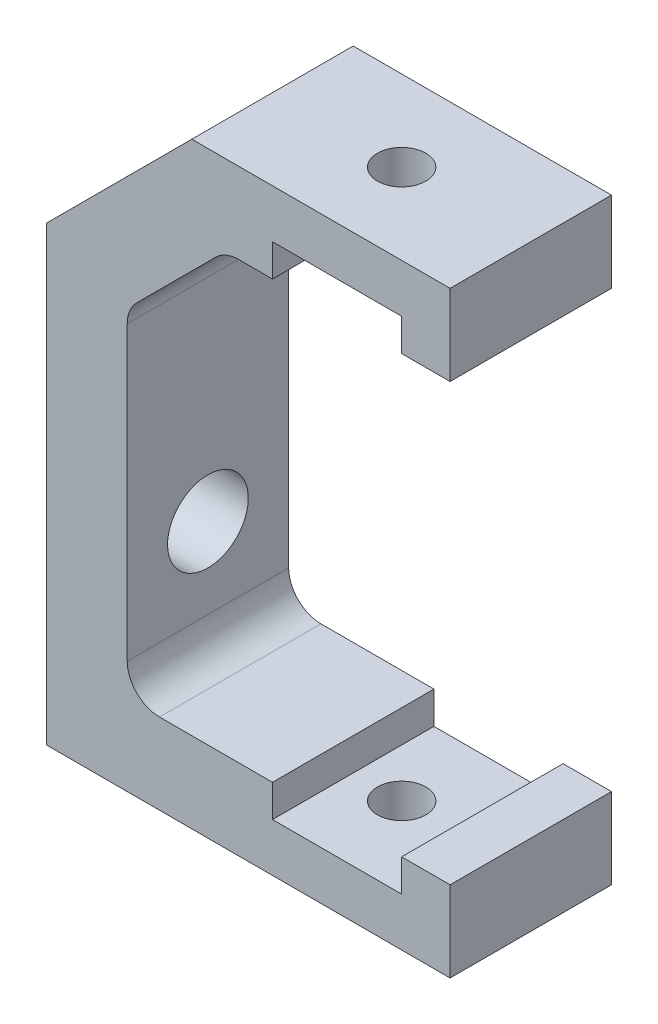
ISO-10303-21;
HEADER;
FILE_DESCRIPTION(('STEP AP214'),'2;1');
FILE_NAME('part.step','',(''),(''),'','','');
FILE_SCHEMA(('AUTOMOTIVE_DESIGN { 1 0 10303 214 1 1 1 1 }'));
ENDSEC;
DATA;
#1=APPLICATION_CONTEXT('core data for automotive mechanical design processes');
#2=APPLICATION_PROTOCOL_DEFINITION('international standard','automotive_design',2000,#1);
#3=PRODUCT_CONTEXT('',#1,'mechanical');
#4=PRODUCT('Part','Part','',(#3));
#5=PRODUCT_RELATED_PRODUCT_CATEGORY('part','',(#4));
#6=PRODUCT_DEFINITION_FORMATION('','',#4);
#7=PRODUCT_DEFINITION_CONTEXT('part definition',#1,'design');
#8=PRODUCT_DEFINITION('design','',#6,#7);
#9=PRODUCT_DEFINITION_SHAPE('','',#8);
#10=(LENGTH_UNIT() NAMED_UNIT(*) SI_UNIT(.MILLI.,.METRE.));
#11=(NAMED_UNIT(*) PLANE_ANGLE_UNIT() SI_UNIT($,.RADIAN.));
#12=(NAMED_UNIT(*) SI_UNIT($,.STERADIAN.) SOLID_ANGLE_UNIT());
#13=UNCERTAINTY_MEASURE_WITH_UNIT(LENGTH_MEASURE(1.E-05),#10,'distance_accuracy_value','');
#14=(GEOMETRIC_REPRESENTATION_CONTEXT(3) GLOBAL_UNCERTAINTY_ASSIGNED_CONTEXT((#13)) GLOBAL_UNIT_ASSIGNED_CONTEXT((#10,
#11,#12)) REPRESENTATION_CONTEXT('',''));
#15=CARTESIAN_POINT('',(0.,0.,0.));
#16=DIRECTION('',(0.,0.,1.));
#17=DIRECTION('',(1.,0.,0.));
#18=AXIS2_PLACEMENT_3D('',#15,#16,#17);
#19=CARTESIAN_POINT('',(25.,0.,5.));
#20=DIRECTION('',(0.,1.,0.));
#21=DIRECTION('',(-1.,0.,0.));
#22=AXIS2_PLACEMENT_3D('',#19,#20,#21);
#23=PLANE('',#22);
#24=CARTESIAN_POINT('',(17.,0.,0.));
#25=DIRECTION('',(0.,1.,0.));
#26=DIRECTION('',(-1.,0.,0.));
#27=AXIS2_PLACEMENT_3D('',#24,#25,#26);
#28=CIRCLE('',#27,1.5);
#29=CARTESIAN_POINT('',(15.5,0.,0.));
#30=VERTEX_POINT('',#29);
#31=EDGE_CURVE('E395',#30,#30,#28,.F.);
#32=ORIENTED_EDGE('',*,*,#31,.F.);
#33=EDGE_LOOP('',(#32));
#34=FACE_BOUND('',#33,.T.);
#35=DIRECTION('',(1.,0.,0.));
#36=VECTOR('',#35,1.);
#37=CARTESIAN_POINT('',(25.,0.,-5.));
#38=LINE('',#37,#36);
#39=CARTESIAN_POINT('',(0.,0.,-5.));
#40=VERTEX_POINT('',#39);
#41=CARTESIAN_POINT('',(25.,0.,-5.));
#42=VERTEX_POINT('',#41);
#43=EDGE_CURVE('E214',#40,#42,#38,.T.);
#44=ORIENTED_EDGE('',*,*,#43,.T.);
#45=DIRECTION('',(0.,0.,-1.));
#46=VECTOR('',#45,1.);
#47=CARTESIAN_POINT('',(25.,0.,5.));
#48=LINE('',#47,#46);
#49=CARTESIAN_POINT('',(25.,0.,5.));
#50=VERTEX_POINT('',#49);
#51=EDGE_CURVE('E11',#50,#42,#48,.T.);
#52=ORIENTED_EDGE('',*,*,#51,.F.);
#53=DIRECTION('',(1.,0.,0.));
#54=VECTOR('',#53,1.);
#55=CARTESIAN_POINT('',(25.,0.,5.));
#56=LINE('',#55,#54);
#57=CARTESIAN_POINT('',(0.,0.,5.));
#58=VERTEX_POINT('',#57);
#59=EDGE_CURVE('E258',#58,#50,#56,.T.);
#60=ORIENTED_EDGE('',*,*,#59,.F.);
#61=DIRECTION('',(0.,0.,-1.));
#62=VECTOR('',#61,1.);
#63=CARTESIAN_POINT('',(0.,0.,5.));
#64=LINE('',#63,#62);
#65=EDGE_CURVE('E211',#58,#40,#64,.T.);
#66=ORIENTED_EDGE('',*,*,#65,.T.);
#67=EDGE_LOOP('',(#44,#52,#60,#66));
#68=FACE_BOUND('',#67,.T.);
#69=ADVANCED_FACE('F41',(#34,#68),#23,.F.);
#70=CARTESIAN_POINT('',(25.,5.,5.));
#71=DIRECTION('',(-1.,0.,0.));
#72=DIRECTION('',(0.,0.,1.));
#73=AXIS2_PLACEMENT_3D('',#70,#71,#72);
#74=PLANE('',#73);
#75=DIRECTION('',(0.,1.,0.));
#76=VECTOR('',#75,1.);
#77=CARTESIAN_POINT('',(25.,5.,-5.));
#78=LINE('',#77,#76);
#79=CARTESIAN_POINT('',(25.,5.,-5.));
#80=VERTEX_POINT('',#79);
#81=EDGE_CURVE('E217',#42,#80,#78,.T.);
#82=ORIENTED_EDGE('',*,*,#81,.T.);
#83=DIRECTION('',(0.,0.,-1.));
#84=VECTOR('',#83,1.);
#85=CARTESIAN_POINT('',(25.,5.,5.));
#86=LINE('',#85,#84);
#87=CARTESIAN_POINT('',(25.,5.,5.));
#88=VERTEX_POINT('',#87);
#89=EDGE_CURVE('E47',#88,#80,#86,.T.);
#90=ORIENTED_EDGE('',*,*,#89,.F.);
#91=DIRECTION('',(0.,1.,0.));
#92=VECTOR('',#91,1.);
#93=CARTESIAN_POINT('',(25.,5.,5.));
#94=LINE('',#93,#92);
#95=EDGE_CURVE('E136',#50,#88,#94,.T.);
#96=ORIENTED_EDGE('',*,*,#95,.F.);
#97=ORIENTED_EDGE('',*,*,#51,.T.);
#98=EDGE_LOOP('',(#82,#90,#96,#97));
#99=FACE_BOUND('',#98,.T.);
#100=ADVANCED_FACE('F382',(#99),#74,.F.);
#101=CARTESIAN_POINT('',(22.,5.,5.));
#102=DIRECTION('',(0.,-1.,0.));
#103=DIRECTION('',(1.,0.,0.));
#104=AXIS2_PLACEMENT_3D('',#101,#102,#103);
#105=PLANE('',#104);
#106=DIRECTION('',(-1.,0.,0.));
#107=VECTOR('',#106,1.);
#108=CARTESIAN_POINT('',(22.,5.,-5.));
#109=LINE('',#108,#107);
#110=CARTESIAN_POINT('',(22.,5.,-5.));
#111=VERTEX_POINT('',#110);
#112=EDGE_CURVE('E222',#80,#111,#109,.T.);
#113=ORIENTED_EDGE('',*,*,#112,.T.);
#114=DIRECTION('',(0.,0.,-1.));
#115=VECTOR('',#114,1.);
#116=CARTESIAN_POINT('',(22.,5.,5.));
#117=LINE('',#116,#115);
#118=CARTESIAN_POINT('',(22.,5.,5.));
#119=VERTEX_POINT('',#118);
#120=EDGE_CURVE('E305',#119,#111,#117,.T.);
#121=ORIENTED_EDGE('',*,*,#120,.F.);
#122=DIRECTION('',(-1.,0.,0.));
#123=VECTOR('',#122,1.);
#124=CARTESIAN_POINT('',(22.,5.,5.));
#125=LINE('',#124,#123);
#126=EDGE_CURVE('E309',#88,#119,#125,.T.);
#127=ORIENTED_EDGE('',*,*,#126,.F.);
#128=ORIENTED_EDGE('',*,*,#89,.T.);
#129=EDGE_LOOP('',(#113,#121,#127,#128));
#130=FACE_BOUND('',#129,.T.);
#131=ADVANCED_FACE('F306',(#130),#105,.F.);
#132=CARTESIAN_POINT('',(22.,3.,5.));
#133=DIRECTION('',(1.,0.,0.));
#134=DIRECTION('',(0.,0.,-1.));
#135=AXIS2_PLACEMENT_3D('',#132,#133,#134);
#136=PLANE('',#135);
#137=DIRECTION('',(0.,-1.,0.));
#138=VECTOR('',#137,1.);
#139=CARTESIAN_POINT('',(22.,3.,-5.));
#140=LINE('',#139,#138);
#141=CARTESIAN_POINT('',(22.,3.,-5.));
#142=VERTEX_POINT('',#141);
#143=EDGE_CURVE('E224',#111,#142,#140,.T.);
#144=ORIENTED_EDGE('',*,*,#143,.T.);
#145=DIRECTION('',(0.,0.,-1.));
#146=VECTOR('',#145,1.);
#147=CARTESIAN_POINT('',(22.,3.,5.));
#148=LINE('',#147,#146);
#149=CARTESIAN_POINT('',(22.,3.,5.));
#150=VERTEX_POINT('',#149);
#151=EDGE_CURVE('E296',#150,#142,#148,.T.);
#152=ORIENTED_EDGE('',*,*,#151,.F.);
#153=DIRECTION('',(0.,-1.,0.));
#154=VECTOR('',#153,1.);
#155=CARTESIAN_POINT('',(22.,3.,5.));
#156=LINE('',#155,#154);
#157=EDGE_CURVE('E327',#119,#150,#156,.T.);
#158=ORIENTED_EDGE('',*,*,#157,.F.);
#159=ORIENTED_EDGE('',*,*,#120,.T.);
#160=EDGE_LOOP('',(#144,#152,#158,#159));
#161=FACE_BOUND('',#160,.T.);
#162=ADVANCED_FACE('F317',(#161),#136,.F.);
#163=CARTESIAN_POINT('',(14.,3.,5.));
#164=DIRECTION('',(0.,-1.,0.));
#165=DIRECTION('',(0.,0.,-1.));
#166=AXIS2_PLACEMENT_3D('',#163,#164,#165);
#167=PLANE('',#166);
#168=CARTESIAN_POINT('',(17.,3.,0.));
#169=DIRECTION('',(0.,-1.,0.));
#170=DIRECTION('',(0.,0.,-1.));
#171=AXIS2_PLACEMENT_3D('',#168,#169,#170);
#172=CIRCLE('',#171,1.5);
#173=CARTESIAN_POINT('',(15.5,3.,0.));
#174=VERTEX_POINT('',#173);
#175=EDGE_CURVE('E218',#174,#174,#172,.T.);
#176=ORIENTED_EDGE('',*,*,#175,.T.);
#177=EDGE_LOOP('',(#176));
#178=FACE_BOUND('',#177,.T.);
#179=DIRECTION('',(-1.,0.,0.));
#180=VECTOR('',#179,1.);
#181=CARTESIAN_POINT('',(14.,3.,-5.));
#182=LINE('',#181,#180);
#183=CARTESIAN_POINT('',(14.,3.,-5.));
#184=VERTEX_POINT('',#183);
#185=EDGE_CURVE('E223',#142,#184,#182,.T.);
#186=ORIENTED_EDGE('',*,*,#185,.T.);
#187=DIRECTION('',(0.,0.,-1.));
#188=VECTOR('',#187,1.);
#189=CARTESIAN_POINT('',(14.,3.,5.));
#190=LINE('',#189,#188);
#191=CARTESIAN_POINT('',(14.,3.,5.));
#192=VERTEX_POINT('',#191);
#193=EDGE_CURVE('E297',#192,#184,#190,.T.);
#194=ORIENTED_EDGE('',*,*,#193,.F.);
#195=DIRECTION('',(-1.,0.,0.));
#196=VECTOR('',#195,1.);
#197=CARTESIAN_POINT('',(14.,3.,5.));
#198=LINE('',#197,#196);
#199=EDGE_CURVE('E324',#150,#192,#198,.T.);
#200=ORIENTED_EDGE('',*,*,#199,.F.);
#201=ORIENTED_EDGE('',*,*,#151,.T.);
#202=EDGE_LOOP('',(#186,#194,#200,#201));
#203=FACE_BOUND('',#202,.T.);
#204=ADVANCED_FACE('F323',(#178,#203),#167,.F.);
#205=CARTESIAN_POINT('',(14.,5.,5.));
#206=DIRECTION('',(-1.,0.,0.));
#207=DIRECTION('',(0.,0.,1.));
#208=AXIS2_PLACEMENT_3D('',#205,#206,#207);
#209=PLANE('',#208);
#210=DIRECTION('',(0.,1.,0.));
#211=VECTOR('',#210,1.);
#212=CARTESIAN_POINT('',(14.,5.,-5.));
#213=LINE('',#212,#211);
#214=CARTESIAN_POINT('',(14.,5.,-5.));
#215=VERTEX_POINT('',#214);
#216=EDGE_CURVE('E230',#184,#215,#213,.T.);
#217=ORIENTED_EDGE('',*,*,#216,.T.);
#218=DIRECTION('',(0.,0.,-1.));
#219=VECTOR('',#218,1.);
#220=CARTESIAN_POINT('',(14.,5.,5.));
#221=LINE('',#220,#219);
#222=CARTESIAN_POINT('',(14.,5.,5.));
#223=VERTEX_POINT('',#222);
#224=EDGE_CURVE('E291',#223,#215,#221,.T.);
#225=ORIENTED_EDGE('',*,*,#224,.F.);
#226=DIRECTION('',(0.,1.,0.));
#227=VECTOR('',#226,1.);
#228=CARTESIAN_POINT('',(14.,5.,5.));
#229=LINE('',#228,#227);
#230=EDGE_CURVE('E330',#192,#223,#229,.T.);
#231=ORIENTED_EDGE('',*,*,#230,.F.);
#232=ORIENTED_EDGE('',*,*,#193,.T.);
#233=EDGE_LOOP('',(#217,#225,#231,#232));
#234=FACE_BOUND('',#233,.T.);
#235=ADVANCED_FACE('F521',(#234),#209,.F.);
#236=CARTESIAN_POINT('',(7.,5.,5.));
#237=DIRECTION('',(0.,-1.,0.));
#238=DIRECTION('',(1.,0.,0.));
#239=AXIS2_PLACEMENT_3D('',#236,#237,#238);
#240=PLANE('',#239);
#241=DIRECTION('',(-1.,0.,0.));
#242=VECTOR('',#241,1.);
#243=CARTESIAN_POINT('',(7.,5.,-5.));
#244=LINE('',#243,#242);
#245=CARTESIAN_POINT('',(7.,5.,-5.));
#246=VERTEX_POINT('',#245);
#247=EDGE_CURVE('E226',#215,#246,#244,.T.);
#248=ORIENTED_EDGE('',*,*,#247,.T.);
#249=DIRECTION('',(0.,0.,-1.));
#250=VECTOR('',#249,1.);
#251=CARTESIAN_POINT('',(7.,5.,5.));
#252=LINE('',#251,#250);
#253=CARTESIAN_POINT('',(7.,5.,5.));
#254=VERTEX_POINT('',#253);
#255=EDGE_CURVE('E288',#254,#246,#252,.T.);
#256=ORIENTED_EDGE('',*,*,#255,.F.);
#257=DIRECTION('',(-1.,0.,0.));
#258=VECTOR('',#257,1.);
#259=CARTESIAN_POINT('',(7.,5.,5.));
#260=LINE('',#259,#258);
#261=EDGE_CURVE('E329',#223,#254,#260,.T.);
#262=ORIENTED_EDGE('',*,*,#261,.F.);
#263=ORIENTED_EDGE('',*,*,#224,.T.);
#264=EDGE_LOOP('',(#248,#256,#262,#263));
#265=FACE_BOUND('',#264,.T.);
#266=ADVANCED_FACE('F513',(#265),#240,.F.);
#267=CARTESIAN_POINT('',(7.,7.,5.));
#268=DIRECTION('',(0.,0.,-1.));
#269=DIRECTION('',(-1.,0.,0.));
#270=AXIS2_PLACEMENT_3D('',#267,#268,#269);
#271=CYLINDRICAL_SURFACE('',#270,2.);
#272=CARTESIAN_POINT('',(7.,7.,-5.));
#273=DIRECTION('',(0.,0.,-1.));
#274=DIRECTION('',(-1.,0.,0.));
#275=AXIS2_PLACEMENT_3D('',#272,#273,#274);
#276=CIRCLE('',#275,2.);
#277=CARTESIAN_POINT('',(4.99999999999999,7.,-5.));
#278=VERTEX_POINT('',#277);
#279=EDGE_CURVE('E232',#246,#278,#276,.T.);
#280=ORIENTED_EDGE('',*,*,#279,.T.);
#281=DIRECTION('',(0.,0.,-1.));
#282=VECTOR('',#281,1.);
#283=CARTESIAN_POINT('',(4.99999999999999,7.,5.));
#284=LINE('',#283,#282);
#285=CARTESIAN_POINT('',(4.99999999999999,7.,5.));
#286=VERTEX_POINT('',#285);
#287=EDGE_CURVE('E290',#286,#278,#284,.T.);
#288=ORIENTED_EDGE('',*,*,#287,.F.);
#289=CARTESIAN_POINT('',(7.,7.,5.));
#290=DIRECTION('',(0.,0.,-1.));
#291=DIRECTION('',(-1.,0.,0.));
#292=AXIS2_PLACEMENT_3D('',#289,#290,#291);
#293=CIRCLE('',#292,2.);
#294=EDGE_CURVE('E337',#254,#286,#293,.T.);
#295=ORIENTED_EDGE('',*,*,#294,.F.);
#296=ORIENTED_EDGE('',*,*,#255,.T.);
#297=EDGE_LOOP('',(#280,#288,#295,#296));
#298=FACE_BOUND('',#297,.T.);
#299=ADVANCED_FACE('F512',(#298),#271,.F.);
#300=CARTESIAN_POINT('',(4.99999999999999,25.1005050633883,5.));
#301=DIRECTION('',(-1.,0.,0.));
#302=DIRECTION('',(0.,-1.,0.));
#303=AXIS2_PLACEMENT_3D('',#300,#301,#302);
#304=PLANE('',#303);
#305=CARTESIAN_POINT('',(4.99999999999999,12.,0.));
#306=DIRECTION('',(1.,0.,0.));
#307=DIRECTION('',(0.,1.,0.));
#308=AXIS2_PLACEMENT_3D('',#305,#306,#307);
#309=CIRCLE('',#308,2.5);
#310=CARTESIAN_POINT('',(4.99999999999999,14.5,0.));
#311=VERTEX_POINT('',#310);
#312=EDGE_CURVE('E665',#311,#311,#309,.T.);
#313=ORIENTED_EDGE('',*,*,#312,.F.);
#314=EDGE_LOOP('',(#313));
#315=FACE_BOUND('',#314,.T.);
#316=DIRECTION('',(0.,1.,0.));
#317=VECTOR('',#316,1.);
#318=CARTESIAN_POINT('',(4.99999999999999,25.1005050633883,-5.));
#319=LINE('',#318,#317);
#320=CARTESIAN_POINT('',(5.,25.1005050633883,-5.));
#321=VERTEX_POINT('',#320);
#322=EDGE_CURVE('E234',#278,#321,#319,.T.);
#323=ORIENTED_EDGE('',*,*,#322,.T.);
#324=DIRECTION('',(0.,0.,-1.));
#325=VECTOR('',#324,1.);
#326=CARTESIAN_POINT('',(5.,25.1005050633883,5.));
#327=LINE('',#326,#325);
#328=CARTESIAN_POINT('',(5.,25.1005050633883,5.));
#329=VERTEX_POINT('',#328);
#330=EDGE_CURVE('E281',#329,#321,#327,.T.);
#331=ORIENTED_EDGE('',*,*,#330,.F.);
#332=DIRECTION('',(0.,1.,0.));
#333=VECTOR('',#332,1.);
#334=CARTESIAN_POINT('',(4.99999999999999,25.1005050633883,5.));
#335=LINE('',#334,#333);
#336=EDGE_CURVE('E339',#286,#329,#335,.T.);
#337=ORIENTED_EDGE('',*,*,#336,.F.);
#338=ORIENTED_EDGE('',*,*,#287,.T.);
#339=EDGE_LOOP('',(#323,#331,#337,#338));
#340=FACE_BOUND('',#339,.T.);
#341=ADVANCED_FACE('F501',(#315,#340),#304,.F.);
#342=CARTESIAN_POINT('',(6.99999999999999,25.1005050633883,5.));
#343=DIRECTION('',(0.,0.,-1.));
#344=DIRECTION('',(-1.,0.,0.));
#345=AXIS2_PLACEMENT_3D('',#342,#343,#344);
#346=CYLINDRICAL_SURFACE('',#345,2.);
#347=CARTESIAN_POINT('',(6.99999999999999,25.1005050633883,-5.));
#348=DIRECTION('',(0.,0.,-1.));
#349=DIRECTION('',(-1.,0.,0.));
#350=AXIS2_PLACEMENT_3D('',#347,#348,#349);
#351=CIRCLE('',#350,2.);
#352=CARTESIAN_POINT('',(5.5857864376269,26.5147186257614,-5.));
#353=VERTEX_POINT('',#352);
#354=EDGE_CURVE('E233',#321,#353,#351,.T.);
#355=ORIENTED_EDGE('',*,*,#354,.T.);
#356=DIRECTION('',(0.,0.,-1.));
#357=VECTOR('',#356,1.);
#358=CARTESIAN_POINT('',(5.5857864376269,26.5147186257614,5.));
#359=LINE('',#358,#357);
#360=CARTESIAN_POINT('',(5.5857864376269,26.5147186257614,5.));
#361=VERTEX_POINT('',#360);
#362=EDGE_CURVE('E282',#361,#353,#359,.T.);
#363=ORIENTED_EDGE('',*,*,#362,.F.);
#364=CARTESIAN_POINT('',(6.99999999999999,25.1005050633883,5.));
#365=DIRECTION('',(0.,0.,-1.));
#366=DIRECTION('',(-1.,0.,0.));
#367=AXIS2_PLACEMENT_3D('',#364,#365,#366);
#368=CIRCLE('',#367,2.);
#369=EDGE_CURVE('E338',#329,#361,#368,.T.);
#370=ORIENTED_EDGE('',*,*,#369,.F.);
#371=ORIENTED_EDGE('',*,*,#330,.T.);
#372=EDGE_LOOP('',(#355,#363,#370,#371));
#373=FACE_BOUND('',#372,.T.);
#374=ADVANCED_FACE('F494',(#373),#346,.F.);
#375=CARTESIAN_POINT('',(10.4852813742386,31.4142135623731,5.));
#376=DIRECTION('',(-0.707106781186547,0.707106781186548,0.));
#377=DIRECTION('',(-0.707106781186548,-0.707106781186547,0.));
#378=AXIS2_PLACEMENT_3D('',#375,#376,#377);
#379=PLANE('',#378);
#380=DIRECTION('',(0.707106781186548,0.707106781186547,0.));
#381=VECTOR('',#380,1.);
#382=CARTESIAN_POINT('',(10.4852813742386,31.4142135623731,-5.));
#383=LINE('',#382,#381);
#384=CARTESIAN_POINT('',(10.4852813742386,31.4142135623731,-5.));
#385=VERTEX_POINT('',#384);
#386=EDGE_CURVE('E240',#353,#385,#383,.T.);
#387=ORIENTED_EDGE('',*,*,#386,.T.);
#388=DIRECTION('',(0.,0.,-1.));
#389=VECTOR('',#388,1.);
#390=CARTESIAN_POINT('',(10.4852813742386,31.4142135623731,5.));
#391=LINE('',#390,#389);
#392=CARTESIAN_POINT('',(10.4852813742386,31.4142135623731,5.));
#393=VERTEX_POINT('',#392);
#394=EDGE_CURVE('E279',#393,#385,#391,.T.);
#395=ORIENTED_EDGE('',*,*,#394,.F.);
#396=DIRECTION('',(0.707106781186548,0.707106781186547,0.));
#397=VECTOR('',#396,1.);
#398=CARTESIAN_POINT('',(10.4852813742386,31.4142135623731,5.));
#399=LINE('',#398,#397);
#400=EDGE_CURVE('E345',#361,#393,#399,.T.);
#401=ORIENTED_EDGE('',*,*,#400,.F.);
#402=ORIENTED_EDGE('',*,*,#362,.T.);
#403=EDGE_LOOP('',(#387,#395,#401,#402));
#404=FACE_BOUND('',#403,.T.);
#405=ADVANCED_FACE('F486',(#404),#379,.F.);
#406=CARTESIAN_POINT('',(11.8994949366117,30.,5.));
#407=DIRECTION('',(0.,0.,-1.));
#408=DIRECTION('',(-1.,0.,0.));
#409=AXIS2_PLACEMENT_3D('',#406,#407,#408);
#410=CYLINDRICAL_SURFACE('',#409,2.);
#411=CARTESIAN_POINT('',(11.8994949366117,30.,-5.));
#412=DIRECTION('',(0.,0.,-1.));
#413=DIRECTION('',(-1.,0.,0.));
#414=AXIS2_PLACEMENT_3D('',#411,#412,#413);
#415=CIRCLE('',#414,2.);
#416=CARTESIAN_POINT('',(11.8994949366117,32.,-5.));
#417=VERTEX_POINT('',#416);
#418=EDGE_CURVE('E239',#385,#417,#415,.T.);
#419=ORIENTED_EDGE('',*,*,#418,.T.);
#420=DIRECTION('',(0.,0.,-1.));
#421=VECTOR('',#420,1.);
#422=CARTESIAN_POINT('',(11.8994949366117,32.,5.));
#423=LINE('',#422,#421);
#424=CARTESIAN_POINT('',(11.8994949366117,32.,5.));
#425=VERTEX_POINT('',#424);
#426=EDGE_CURVE('E274',#425,#417,#423,.T.);
#427=ORIENTED_EDGE('',*,*,#426,.F.);
#428=CARTESIAN_POINT('',(11.8994949366117,30.,5.));
#429=DIRECTION('',(0.,0.,-1.));
#430=DIRECTION('',(-1.,0.,0.));
#431=AXIS2_PLACEMENT_3D('',#428,#429,#430);
#432=CIRCLE('',#431,2.);
#433=EDGE_CURVE('E341',#393,#425,#432,.T.);
#434=ORIENTED_EDGE('',*,*,#433,.F.);
#435=ORIENTED_EDGE('',*,*,#394,.T.);
#436=EDGE_LOOP('',(#419,#427,#434,#435));
#437=FACE_BOUND('',#436,.T.);
#438=ADVANCED_FACE('F480',(#437),#410,.F.);
#439=CARTESIAN_POINT('',(14.,32.,5.));
#440=DIRECTION('',(0.,1.,0.));
#441=DIRECTION('',(0.,0.,1.));
#442=AXIS2_PLACEMENT_3D('',#439,#440,#441);
#443=PLANE('',#442);
#444=DIRECTION('',(1.,0.,0.));
#445=VECTOR('',#444,1.);
#446=CARTESIAN_POINT('',(14.,32.,-5.));
#447=LINE('',#446,#445);
#448=CARTESIAN_POINT('',(14.,32.,-5.));
#449=VERTEX_POINT('',#448);
#450=EDGE_CURVE('E242',#417,#449,#447,.T.);
#451=ORIENTED_EDGE('',*,*,#450,.T.);
#452=DIRECTION('',(0.,0.,-1.));
#453=VECTOR('',#452,1.);
#454=CARTESIAN_POINT('',(14.,32.,5.));
#455=LINE('',#454,#453);
#456=CARTESIAN_POINT('',(14.,32.,5.));
#457=VERTEX_POINT('',#456);
#458=EDGE_CURVE('E275',#457,#449,#455,.T.);
#459=ORIENTED_EDGE('',*,*,#458,.F.);
#460=DIRECTION('',(1.,0.,0.));
#461=VECTOR('',#460,1.);
#462=CARTESIAN_POINT('',(14.,32.,5.));
#463=LINE('',#462,#461);
#464=EDGE_CURVE('E347',#425,#457,#463,.T.);
#465=ORIENTED_EDGE('',*,*,#464,.F.);
#466=ORIENTED_EDGE('',*,*,#426,.T.);
#467=EDGE_LOOP('',(#451,#459,#465,#466));
#468=FACE_BOUND('',#467,.T.);
#469=ADVANCED_FACE('F469',(#468),#443,.F.);
#470=CARTESIAN_POINT('',(14.,34.,5.));
#471=DIRECTION('',(-1.,0.,0.));
#472=DIRECTION('',(0.,0.,1.));
#473=AXIS2_PLACEMENT_3D('',#470,#471,#472);
#474=PLANE('',#473);
#475=DIRECTION('',(0.,1.,0.));
#476=VECTOR('',#475,1.);
#477=CARTESIAN_POINT('',(14.,34.,-5.));
#478=LINE('',#477,#476);
#479=CARTESIAN_POINT('',(14.,34.,-5.));
#480=VERTEX_POINT('',#479);
#481=EDGE_CURVE('E244',#449,#480,#478,.T.);
#482=ORIENTED_EDGE('',*,*,#481,.T.);
#483=DIRECTION('',(0.,0.,-1.));
#484=VECTOR('',#483,1.);
#485=CARTESIAN_POINT('',(14.,34.,5.));
#486=LINE('',#485,#484);
#487=CARTESIAN_POINT('',(14.,34.,5.));
#488=VERTEX_POINT('',#487);
#489=EDGE_CURVE('E267',#488,#480,#486,.T.);
#490=ORIENTED_EDGE('',*,*,#489,.F.);
#491=DIRECTION('',(0.,1.,0.));
#492=VECTOR('',#491,1.);
#493=CARTESIAN_POINT('',(14.,34.,5.));
#494=LINE('',#493,#492);
#495=EDGE_CURVE('E346',#457,#488,#494,.T.);
#496=ORIENTED_EDGE('',*,*,#495,.F.);
#497=ORIENTED_EDGE('',*,*,#458,.T.);
#498=EDGE_LOOP('',(#482,#490,#496,#497));
#499=FACE_BOUND('',#498,.T.);
#500=ADVANCED_FACE('F461',(#499),#474,.F.);
#501=CARTESIAN_POINT('',(22.,34.,5.));
#502=DIRECTION('',(0.,1.,0.));
#503=DIRECTION('',(0.,0.,1.));
#504=AXIS2_PLACEMENT_3D('',#501,#502,#503);
#505=PLANE('',#504);
#506=CARTESIAN_POINT('',(17.,34.,0.));
#507=DIRECTION('',(0.,1.,0.));
#508=DIRECTION('',(0.,0.,1.));
#509=AXIS2_PLACEMENT_3D('',#506,#507,#508);
#510=CIRCLE('',#509,1.5);
#511=CARTESIAN_POINT('',(15.5,34.,0.));
#512=VERTEX_POINT('',#511);
#513=EDGE_CURVE('E391',#512,#512,#510,.T.);
#514=ORIENTED_EDGE('',*,*,#513,.T.);
#515=EDGE_LOOP('',(#514));
#516=FACE_BOUND('',#515,.T.);
#517=DIRECTION('',(1.,0.,0.));
#518=VECTOR('',#517,1.);
#519=CARTESIAN_POINT('',(22.,34.,-5.));
#520=LINE('',#519,#518);
#521=CARTESIAN_POINT('',(22.,34.,-5.));
#522=VERTEX_POINT('',#521);
#523=EDGE_CURVE('E243',#480,#522,#520,.T.);
#524=ORIENTED_EDGE('',*,*,#523,.T.);
#525=DIRECTION('',(0.,0.,-1.));
#526=VECTOR('',#525,1.);
#527=CARTESIAN_POINT('',(22.,34.,5.));
#528=LINE('',#527,#526);
#529=CARTESIAN_POINT('',(22.,34.,5.));
#530=VERTEX_POINT('',#529);
#531=EDGE_CURVE('E266',#530,#522,#528,.T.);
#532=ORIENTED_EDGE('',*,*,#531,.F.);
#533=DIRECTION('',(1.,0.,0.));
#534=VECTOR('',#533,1.);
#535=CARTESIAN_POINT('',(22.,34.,5.));
#536=LINE('',#535,#534);
#537=EDGE_CURVE('E348',#488,#530,#536,.T.);
#538=ORIENTED_EDGE('',*,*,#537,.F.);
#539=ORIENTED_EDGE('',*,*,#489,.T.);
#540=EDGE_LOOP('',(#524,#532,#538,#539));
#541=FACE_BOUND('',#540,.T.);
#542=ADVANCED_FACE('F460',(#516,#541),#505,.F.);
#543=CARTESIAN_POINT('',(22.,32.,5.));
#544=DIRECTION('',(1.,0.,0.));
#545=DIRECTION('',(0.,0.,-1.));
#546=AXIS2_PLACEMENT_3D('',#543,#544,#545);
#547=PLANE('',#546);
#548=DIRECTION('',(0.,-1.,0.));
#549=VECTOR('',#548,1.);
#550=CARTESIAN_POINT('',(22.,32.,-5.));
#551=LINE('',#550,#549);
#552=CARTESIAN_POINT('',(22.,32.,-5.));
#553=VERTEX_POINT('',#552);
#554=EDGE_CURVE('E250',#522,#553,#551,.T.);
#555=ORIENTED_EDGE('',*,*,#554,.T.);
#556=DIRECTION('',(0.,0.,-1.));
#557=VECTOR('',#556,1.);
#558=CARTESIAN_POINT('',(22.,32.,5.));
#559=LINE('',#558,#557);
#560=CARTESIAN_POINT('',(22.,32.,5.));
#561=VERTEX_POINT('',#560);
#562=EDGE_CURVE('E263',#561,#553,#559,.T.);
#563=ORIENTED_EDGE('',*,*,#562,.F.);
#564=DIRECTION('',(0.,-1.,0.));
#565=VECTOR('',#564,1.);
#566=CARTESIAN_POINT('',(22.,32.,5.));
#567=LINE('',#566,#565);
#568=EDGE_CURVE('E355',#530,#561,#567,.T.);
#569=ORIENTED_EDGE('',*,*,#568,.F.);
#570=ORIENTED_EDGE('',*,*,#531,.T.);
#571=EDGE_LOOP('',(#555,#563,#569,#570));
#572=FACE_BOUND('',#571,.T.);
#573=ADVANCED_FACE('F446',(#572),#547,.F.);
#574=CARTESIAN_POINT('',(25.,32.,5.));
#575=DIRECTION('',(0.,1.,0.));
#576=DIRECTION('',(0.,0.,1.));
#577=AXIS2_PLACEMENT_3D('',#574,#575,#576);
#578=PLANE('',#577);
#579=DIRECTION('',(1.,0.,0.));
#580=VECTOR('',#579,1.);
#581=CARTESIAN_POINT('',(25.,32.,-5.));
#582=LINE('',#581,#580);
#583=CARTESIAN_POINT('',(25.,32.,-5.));
#584=VERTEX_POINT('',#583);
#585=EDGE_CURVE('E246',#553,#584,#582,.T.);
#586=ORIENTED_EDGE('',*,*,#585,.T.);
#587=DIRECTION('',(0.,0.,-1.));
#588=VECTOR('',#587,1.);
#589=CARTESIAN_POINT('',(25.,32.,5.));
#590=LINE('',#589,#588);
#591=CARTESIAN_POINT('',(25.,32.,5.));
#592=VERTEX_POINT('',#591);
#593=EDGE_CURVE('E257',#592,#584,#590,.T.);
#594=ORIENTED_EDGE('',*,*,#593,.F.);
#595=DIRECTION('',(1.,0.,0.));
#596=VECTOR('',#595,1.);
#597=CARTESIAN_POINT('',(25.,32.,5.));
#598=LINE('',#597,#596);
#599=EDGE_CURVE('E351',#561,#592,#598,.T.);
#600=ORIENTED_EDGE('',*,*,#599,.F.);
#601=ORIENTED_EDGE('',*,*,#562,.T.);
#602=EDGE_LOOP('',(#586,#594,#600,#601));
#603=FACE_BOUND('',#602,.T.);
#604=ADVANCED_FACE('F358',(#603),#578,.F.);
#605=CARTESIAN_POINT('',(25.,37.,5.));
#606=DIRECTION('',(-1.,0.,0.));
#607=DIRECTION('',(0.,-1.,0.));
#608=AXIS2_PLACEMENT_3D('',#605,#606,#607);
#609=PLANE('',#608);
#610=DIRECTION('',(0.,1.,0.));
#611=VECTOR('',#610,1.);
#612=CARTESIAN_POINT('',(25.,37.,-5.));
#613=LINE('',#612,#611);
#614=CARTESIAN_POINT('',(25.,37.,-5.));
#615=VERTEX_POINT('',#614);
#616=EDGE_CURVE('E253',#584,#615,#613,.T.);
#617=ORIENTED_EDGE('',*,*,#616,.T.);
#618=DIRECTION('',(0.,0.,-1.));
#619=VECTOR('',#618,1.);
#620=CARTESIAN_POINT('',(25.,37.,5.));
#621=LINE('',#620,#619);
#622=CARTESIAN_POINT('',(25.,37.,5.));
#623=VERTEX_POINT('',#622);
#624=EDGE_CURVE('E206',#623,#615,#621,.T.);
#625=ORIENTED_EDGE('',*,*,#624,.F.);
#626=DIRECTION('',(0.,1.,0.));
#627=VECTOR('',#626,1.);
#628=CARTESIAN_POINT('',(25.,37.,5.));
#629=LINE('',#628,#627);
#630=EDGE_CURVE('E197',#592,#623,#629,.T.);
#631=ORIENTED_EDGE('',*,*,#630,.F.);
#632=ORIENTED_EDGE('',*,*,#593,.T.);
#633=EDGE_LOOP('',(#617,#625,#631,#632));
#634=FACE_BOUND('',#633,.T.);
#635=ADVANCED_FACE('F365',(#634),#609,.F.);
#636=CARTESIAN_POINT('',(9.00000000000001,37.,5.));
#637=DIRECTION('',(0.,-1.,0.));
#638=DIRECTION('',(1.,0.,0.));
#639=AXIS2_PLACEMENT_3D('',#636,#637,#638);
#640=PLANE('',#639);
#641=CARTESIAN_POINT('',(17.,37.,0.));
#642=DIRECTION('',(0.,1.,0.));
#643=DIRECTION('',(-1.,0.,0.));
#644=AXIS2_PLACEMENT_3D('',#641,#642,#643);
#645=CIRCLE('',#644,1.5);
#646=CARTESIAN_POINT('',(15.5,37.,0.));
#647=VERTEX_POINT('',#646);
#648=EDGE_CURVE('E393',#647,#647,#645,.T.);
#649=ORIENTED_EDGE('',*,*,#648,.F.);
#650=EDGE_LOOP('',(#649));
#651=FACE_BOUND('',#650,.T.);
#652=DIRECTION('',(-1.,0.,0.));
#653=VECTOR('',#652,1.);
#654=CARTESIAN_POINT('',(9.00000000000001,37.,-5.));
#655=LINE('',#654,#653);
#656=CARTESIAN_POINT('',(9.00000000000001,37.,-5.));
#657=VERTEX_POINT('',#656);
#658=EDGE_CURVE('E202',#615,#657,#655,.T.);
#659=ORIENTED_EDGE('',*,*,#658,.T.);
#660=DIRECTION('',(0.,0.,-1.));
#661=VECTOR('',#660,1.);
#662=CARTESIAN_POINT('',(9.00000000000001,37.,5.));
#663=LINE('',#662,#661);
#664=CARTESIAN_POINT('',(9.00000000000001,37.,5.));
#665=VERTEX_POINT('',#664);
#666=EDGE_CURVE('E205',#665,#657,#663,.T.);
#667=ORIENTED_EDGE('',*,*,#666,.F.);
#668=DIRECTION('',(-1.,0.,0.));
#669=VECTOR('',#668,1.);
#670=CARTESIAN_POINT('',(9.00000000000001,37.,5.));
#671=LINE('',#670,#669);
#672=EDGE_CURVE('E192',#623,#665,#671,.T.);
#673=ORIENTED_EDGE('',*,*,#672,.F.);
#674=ORIENTED_EDGE('',*,*,#624,.T.);
#675=EDGE_LOOP('',(#659,#667,#673,#674));
#676=FACE_BOUND('',#675,.T.);
#677=ADVANCED_FACE('F201',(#651,#676),#640,.F.);
#678=CARTESIAN_POINT('',(0.,28.,5.));
#679=DIRECTION('',(0.707106781186546,-0.707106781186549,0.));
#680=DIRECTION('',(0.707106781186549,0.707106781186546,0.));
#681=AXIS2_PLACEMENT_3D('',#678,#679,#680);
#682=PLANE('',#681);
#683=DIRECTION('',(-0.707106781186549,-0.707106781186546,0.));
#684=VECTOR('',#683,1.);
#685=CARTESIAN_POINT('',(0.,28.,-5.));
#686=LINE('',#685,#684);
#687=CARTESIAN_POINT('',(0.,28.,-5.));
#688=VERTEX_POINT('',#687);
#689=EDGE_CURVE('E123',#657,#688,#686,.T.);
#690=ORIENTED_EDGE('',*,*,#689,.T.);
#691=DIRECTION('',(0.,0.,-1.));
#692=VECTOR('',#691,1.);
#693=CARTESIAN_POINT('',(0.,28.,5.));
#694=LINE('',#693,#692);
#695=CARTESIAN_POINT('',(0.,28.,5.));
#696=VERTEX_POINT('',#695);
#697=EDGE_CURVE('E210',#696,#688,#694,.T.);
#698=ORIENTED_EDGE('',*,*,#697,.F.);
#699=DIRECTION('',(-0.707106781186549,-0.707106781186546,0.));
#700=VECTOR('',#699,1.);
#701=CARTESIAN_POINT('',(0.,28.,5.));
#702=LINE('',#701,#700);
#703=EDGE_CURVE('E193',#665,#696,#702,.T.);
#704=ORIENTED_EDGE('',*,*,#703,.F.);
#705=ORIENTED_EDGE('',*,*,#666,.T.);
#706=EDGE_LOOP('',(#690,#698,#704,#705));
#707=FACE_BOUND('',#706,.T.);
#708=ADVANCED_FACE('F207',(#707),#682,.F.);
#709=CARTESIAN_POINT('',(0.,0.,5.));
#710=DIRECTION('',(1.,0.,0.));
#711=DIRECTION('',(0.,1.,0.));
#712=AXIS2_PLACEMENT_3D('',#709,#710,#711);
#713=PLANE('',#712);
#714=CARTESIAN_POINT('',(0.,12.,0.));
#715=DIRECTION('',(1.,0.,0.));
#716=DIRECTION('',(0.,1.,0.));
#717=AXIS2_PLACEMENT_3D('',#714,#715,#716);
#718=CIRCLE('',#717,2.5);
#719=CARTESIAN_POINT('',(0.,14.5,0.));
#720=VERTEX_POINT('',#719);
#721=EDGE_CURVE('E398',#720,#720,#718,.F.);
#722=ORIENTED_EDGE('',*,*,#721,.F.);
#723=EDGE_LOOP('',(#722));
#724=FACE_BOUND('',#723,.T.);
#725=DIRECTION('',(0.,-1.,0.));
#726=VECTOR('',#725,1.);
#727=CARTESIAN_POINT('',(0.,0.,-5.));
#728=LINE('',#727,#726);
#729=EDGE_CURVE('E132',#688,#40,#728,.T.);
#730=ORIENTED_EDGE('',*,*,#729,.T.);
#731=ORIENTED_EDGE('',*,*,#65,.F.);
#732=DIRECTION('',(0.,-1.,0.));
#733=VECTOR('',#732,1.);
#734=CARTESIAN_POINT('',(0.,0.,5.));
#735=LINE('',#734,#733);
#736=EDGE_CURVE('E60',#696,#58,#735,.T.);
#737=ORIENTED_EDGE('',*,*,#736,.F.);
#738=ORIENTED_EDGE('',*,*,#697,.T.);
#739=EDGE_LOOP('',(#730,#731,#737,#738));
#740=FACE_BOUND('',#739,.T.);
#741=ADVANCED_FACE('F366',(#724,#740),#713,.F.);
#742=CARTESIAN_POINT('',(11.8994949366117,30.,5.));
#743=DIRECTION('',(0.,0.,-1.));
#744=DIRECTION('',(-1.,0.,0.));
#745=AXIS2_PLACEMENT_3D('',#742,#743,#744);
#746=PLANE('',#745);
#747=ORIENTED_EDGE('',*,*,#59,.T.);
#748=ORIENTED_EDGE('',*,*,#95,.T.);
#749=ORIENTED_EDGE('',*,*,#126,.T.);
#750=ORIENTED_EDGE('',*,*,#157,.T.);
#751=ORIENTED_EDGE('',*,*,#199,.T.);
#752=ORIENTED_EDGE('',*,*,#230,.T.);
#753=ORIENTED_EDGE('',*,*,#261,.T.);
#754=ORIENTED_EDGE('',*,*,#294,.T.);
#755=ORIENTED_EDGE('',*,*,#336,.T.);
#756=ORIENTED_EDGE('',*,*,#369,.T.);
#757=ORIENTED_EDGE('',*,*,#400,.T.);
#758=ORIENTED_EDGE('',*,*,#433,.T.);
#759=ORIENTED_EDGE('',*,*,#464,.T.);
#760=ORIENTED_EDGE('',*,*,#495,.T.);
#761=ORIENTED_EDGE('',*,*,#537,.T.);
#762=ORIENTED_EDGE('',*,*,#568,.T.);
#763=ORIENTED_EDGE('',*,*,#599,.T.);
#764=ORIENTED_EDGE('',*,*,#630,.T.);
#765=ORIENTED_EDGE('',*,*,#672,.T.);
#766=ORIENTED_EDGE('',*,*,#703,.T.);
#767=ORIENTED_EDGE('',*,*,#736,.T.);
#768=EDGE_LOOP('',(#747,#748,#749,#750,#751,#752,#753,#754,#755,#756,#757,#758,#759,#760,#761,
#762,#763,#764,#765,#766,#767));
#769=FACE_BOUND('',#768,.T.);
#770=ADVANCED_FACE('F194',(#769),#746,.F.);
#771=CARTESIAN_POINT('',(11.8994949366117,30.,-5.));
#772=DIRECTION('',(0.,0.,-1.));
#773=DIRECTION('',(-1.,0.,0.));
#774=AXIS2_PLACEMENT_3D('',#771,#772,#773);
#775=PLANE('',#774);
#776=ORIENTED_EDGE('',*,*,#43,.F.);
#777=ORIENTED_EDGE('',*,*,#729,.F.);
#778=ORIENTED_EDGE('',*,*,#689,.F.);
#779=ORIENTED_EDGE('',*,*,#658,.F.);
#780=ORIENTED_EDGE('',*,*,#616,.F.);
#781=ORIENTED_EDGE('',*,*,#585,.F.);
#782=ORIENTED_EDGE('',*,*,#554,.F.);
#783=ORIENTED_EDGE('',*,*,#523,.F.);
#784=ORIENTED_EDGE('',*,*,#481,.F.);
#785=ORIENTED_EDGE('',*,*,#450,.F.);
#786=ORIENTED_EDGE('',*,*,#418,.F.);
#787=ORIENTED_EDGE('',*,*,#386,.F.);
#788=ORIENTED_EDGE('',*,*,#354,.F.);
#789=ORIENTED_EDGE('',*,*,#322,.F.);
#790=ORIENTED_EDGE('',*,*,#279,.F.);
#791=ORIENTED_EDGE('',*,*,#247,.F.);
#792=ORIENTED_EDGE('',*,*,#216,.F.);
#793=ORIENTED_EDGE('',*,*,#185,.F.);
#794=ORIENTED_EDGE('',*,*,#143,.F.);
#795=ORIENTED_EDGE('',*,*,#112,.F.);
#796=ORIENTED_EDGE('',*,*,#81,.F.);
#797=EDGE_LOOP('',(#776,#777,#778,#779,#780,#781,#782,#783,#784,#785,#786,#787,#788,#789,#790,
#791,#792,#793,#794,#795,#796));
#798=FACE_BOUND('',#797,.T.);
#799=ADVANCED_FACE('F314',(#798),#775,.T.);
#800=CARTESIAN_POINT('',(17.,-4.24264068711928,0.));
#801=DIRECTION('',(0.,1.,0.));
#802=DIRECTION('',(-1.,0.,0.));
#803=AXIS2_PLACEMENT_3D('',#800,#801,#802);
#804=CYLINDRICAL_SURFACE('',#803,1.5);
#805=CARTESIAN_POINT('',(15.5,37.,0.));
#806=CARTESIAN_POINT('',(15.5,36.96875,0.));
#807=CARTESIAN_POINT('',(15.5,36.9375,0.));
#808=CARTESIAN_POINT('',(15.5,36.875,0.));
#809=CARTESIAN_POINT('',(15.5,36.84375,0.));
#810=CARTESIAN_POINT('',(15.5,36.78125,0.));
#811=CARTESIAN_POINT('',(15.5,36.75,0.));
#812=CARTESIAN_POINT('',(15.5,36.6875,0.));
#813=CARTESIAN_POINT('',(15.5,36.65625,0.));
#814=CARTESIAN_POINT('',(15.5,36.59375,0.));
#815=CARTESIAN_POINT('',(15.5,36.5625,0.));
#816=CARTESIAN_POINT('',(15.5,36.5,0.));
#817=CARTESIAN_POINT('',(15.5,36.46875,0.));
#818=CARTESIAN_POINT('',(15.5,36.40625,0.));
#819=CARTESIAN_POINT('',(15.5,36.375,0.));
#820=CARTESIAN_POINT('',(15.5,36.3125,0.));
#821=CARTESIAN_POINT('',(15.5,36.28125,0.));
#822=CARTESIAN_POINT('',(15.5,36.21875,0.));
#823=CARTESIAN_POINT('',(15.5,36.1875,0.));
#824=CARTESIAN_POINT('',(15.5,36.125,0.));
#825=CARTESIAN_POINT('',(15.5,36.09375,0.));
#826=CARTESIAN_POINT('',(15.5,36.03125,0.));
#827=CARTESIAN_POINT('',(15.5,36.,0.));
#828=CARTESIAN_POINT('',(15.5,35.9375,0.));
#829=CARTESIAN_POINT('',(15.5,35.90625,0.));
#830=CARTESIAN_POINT('',(15.5,35.84375,0.));
#831=CARTESIAN_POINT('',(15.5,35.8125,0.));
#832=CARTESIAN_POINT('',(15.5,35.75,0.));
#833=CARTESIAN_POINT('',(15.5,35.71875,0.));
#834=CARTESIAN_POINT('',(15.5,35.65625,0.));
#835=CARTESIAN_POINT('',(15.5,35.625,0.));
#836=CARTESIAN_POINT('',(15.5,35.5625,0.));
#837=CARTESIAN_POINT('',(15.5,35.53125,0.));
#838=CARTESIAN_POINT('',(15.5,35.46875,0.));
#839=CARTESIAN_POINT('',(15.5,35.4375,0.));
#840=CARTESIAN_POINT('',(15.5,35.375,0.));
#841=CARTESIAN_POINT('',(15.5,35.34375,0.));
#842=CARTESIAN_POINT('',(15.5,35.28125,0.));
#843=CARTESIAN_POINT('',(15.5,35.25,0.));
#844=CARTESIAN_POINT('',(15.5,35.1875,0.));
#845=CARTESIAN_POINT('',(15.5,35.15625,0.));
#846=CARTESIAN_POINT('',(15.5,35.09375,0.));
#847=CARTESIAN_POINT('',(15.5,35.0625,0.));
#848=CARTESIAN_POINT('',(15.5,35.,0.));
#849=CARTESIAN_POINT('',(15.5,34.96875,0.));
#850=CARTESIAN_POINT('',(15.5,34.90625,0.));
#851=CARTESIAN_POINT('',(15.5,34.875,0.));
#852=CARTESIAN_POINT('',(15.5,34.8125,0.));
#853=CARTESIAN_POINT('',(15.5,34.78125,0.));
#854=CARTESIAN_POINT('',(15.5,34.71875,0.));
#855=CARTESIAN_POINT('',(15.5,34.6875,0.));
#856=CARTESIAN_POINT('',(15.5,34.625,0.));
#857=CARTESIAN_POINT('',(15.5,34.59375,0.));
#858=CARTESIAN_POINT('',(15.5,34.53125,0.));
#859=CARTESIAN_POINT('',(15.5,34.5,0.));
#860=CARTESIAN_POINT('',(15.5,34.4375,0.));
#861=CARTESIAN_POINT('',(15.5,34.40625,0.));
#862=CARTESIAN_POINT('',(15.5,34.34375,0.));
#863=CARTESIAN_POINT('',(15.5,34.3125,0.));
#864=CARTESIAN_POINT('',(15.5,34.25,0.));
#865=CARTESIAN_POINT('',(15.5,34.21875,0.));
#866=CARTESIAN_POINT('',(15.5,34.15625,0.));
#867=CARTESIAN_POINT('',(15.5,34.125,0.));
#868=CARTESIAN_POINT('',(15.5,34.0625,0.));
#869=CARTESIAN_POINT('',(15.5,34.03125,0.));
#870=CARTESIAN_POINT('',(15.5,34.,0.));
#871=B_SPLINE_CURVE_WITH_KNOTS('',3,(#805,#806,#807,#808,#809,#810,#811,#812,#813,#814,#815,
#816,#817,#818,#819,#820,#821,#822,#823,#824,#825,#826,#827,#828,#829,#830,#831,#832,#833,#834,
#835,#836,#837,#838,#839,#840,#841,#842,#843,#844,#845,#846,#847,#848,#849,#850,#851,#852,#853,
#854,#855,#856,#857,#858,#859,#860,#861,#862,#863,#864,#865,#866,#867,#868,#869,#870),
.UNSPECIFIED.,.F.,.F.,(4,2,2,2,2,2,2,2,2,2,2,2,2,2,2,2,2,2,2,2,2,2,2,2,2,2,2,2,2,2,2,2,4),(0.,
0.0937499999999966,0.1875,0.281249999999997,0.375,0.468749999999997,0.5625,0.656249999999997,
0.750000000000001,0.843749999999997,0.937499999999994,1.03125,1.12499999999999,1.21875,
1.31249999999999,1.40625,1.49999999999999,1.59374999999999,1.68749999999999,1.78124999999999,
1.87499999999999,1.96874999999999,2.06249999999999,2.15624999999999,2.24999999999999,
2.34374999999999,2.43749999999999,2.53124999999999,2.62499999999999,2.71874999999999,
2.81249999999999,2.90624999999999,2.99999999999999),.UNSPECIFIED.);
#872=EDGE_CURVE('BSEAM414',#647,#512,#871,.T.);
#873=ORIENTED_EDGE('',*,*,#648,.T.);
#874=ORIENTED_EDGE('',*,*,#513,.F.);
#875=ORIENTED_EDGE('',*,*,#872,.T.);
#876=ORIENTED_EDGE('',*,*,#872,.F.);
#877=EDGE_LOOP('',(#873,#875,#874,#876));
#878=FACE_BOUND('',#877,.T.);
#879=ADVANCED_FACE('F414',(#878),#804,.F.);
#880=CARTESIAN_POINT('',(15.5,0.,0.));
#881=CARTESIAN_POINT('',(15.5,0.03125,0.));
#882=CARTESIAN_POINT('',(15.5,0.0625000000000001,0.));
#883=CARTESIAN_POINT('',(15.5,0.125,0.));
#884=CARTESIAN_POINT('',(15.5,0.15625,0.));
#885=CARTESIAN_POINT('',(15.5,0.21875,0.));
#886=CARTESIAN_POINT('',(15.5,0.25,0.));
#887=CARTESIAN_POINT('',(15.5,0.3125,0.));
#888=CARTESIAN_POINT('',(15.5,0.34375,0.));
#889=CARTESIAN_POINT('',(15.5,0.40625,0.));
#890=CARTESIAN_POINT('',(15.5,0.4375,0.));
#891=CARTESIAN_POINT('',(15.5,0.5,0.));
#892=CARTESIAN_POINT('',(15.5,0.53125,0.));
#893=CARTESIAN_POINT('',(15.5,0.593750000000001,0.));
#894=CARTESIAN_POINT('',(15.5,0.625000000000001,0.));
#895=CARTESIAN_POINT('',(15.5,0.687500000000001,0.));
#896=CARTESIAN_POINT('',(15.5,0.718750000000001,0.));
#897=CARTESIAN_POINT('',(15.5,0.781250000000001,0.));
#898=CARTESIAN_POINT('',(15.5,0.812500000000001,0.));
#899=CARTESIAN_POINT('',(15.5,0.875,0.));
#900=CARTESIAN_POINT('',(15.5,0.90625,0.));
#901=CARTESIAN_POINT('',(15.5,0.96875,0.));
#902=CARTESIAN_POINT('',(15.5,1.,0.));
#903=CARTESIAN_POINT('',(15.5,1.0625,0.));
#904=CARTESIAN_POINT('',(15.5,1.09375,0.));
#905=CARTESIAN_POINT('',(15.5,1.15625,0.));
#906=CARTESIAN_POINT('',(15.5,1.1875,0.));
#907=CARTESIAN_POINT('',(15.5,1.25,0.));
#908=CARTESIAN_POINT('',(15.5,1.28125,0.));
#909=CARTESIAN_POINT('',(15.5,1.34375,0.));
#910=CARTESIAN_POINT('',(15.5,1.375,0.));
#911=CARTESIAN_POINT('',(15.5,1.4375,0.));
#912=CARTESIAN_POINT('',(15.5,1.46875,0.));
#913=CARTESIAN_POINT('',(15.5,1.53125,0.));
#914=CARTESIAN_POINT('',(15.5,1.5625,0.));
#915=CARTESIAN_POINT('',(15.5,1.625,0.));
#916=CARTESIAN_POINT('',(15.5,1.65625,0.));
#917=CARTESIAN_POINT('',(15.5,1.71875,0.));
#918=CARTESIAN_POINT('',(15.5,1.75,0.));
#919=CARTESIAN_POINT('',(15.5,1.8125,0.));
#920=CARTESIAN_POINT('',(15.5,1.84375,0.));
#921=CARTESIAN_POINT('',(15.5,1.90625,0.));
#922=CARTESIAN_POINT('',(15.5,1.9375,0.));
#923=CARTESIAN_POINT('',(15.5,2.,0.));
#924=CARTESIAN_POINT('',(15.5,2.03125,0.));
#925=CARTESIAN_POINT('',(15.5,2.09375,0.));
#926=CARTESIAN_POINT('',(15.5,2.125,0.));
#927=CARTESIAN_POINT('',(15.5,2.1875,0.));
#928=CARTESIAN_POINT('',(15.5,2.21875,0.));
#929=CARTESIAN_POINT('',(15.5,2.28125,0.));
#930=CARTESIAN_POINT('',(15.5,2.3125,0.));
#931=CARTESIAN_POINT('',(15.5,2.375,0.));
#932=CARTESIAN_POINT('',(15.5,2.40625,0.));
#933=CARTESIAN_POINT('',(15.5,2.46875,0.));
#934=CARTESIAN_POINT('',(15.5,2.5,0.));
#935=CARTESIAN_POINT('',(15.5,2.5625,0.));
#936=CARTESIAN_POINT('',(15.5,2.59375,0.));
#937=CARTESIAN_POINT('',(15.5,2.65625,0.));
#938=CARTESIAN_POINT('',(15.5,2.6875,0.));
#939=CARTESIAN_POINT('',(15.5,2.75,0.));
#940=CARTESIAN_POINT('',(15.5,2.78125,0.));
#941=CARTESIAN_POINT('',(15.5,2.84375,0.));
#942=CARTESIAN_POINT('',(15.5,2.875,0.));
#943=CARTESIAN_POINT('',(15.5,2.9375,0.));
#944=CARTESIAN_POINT('',(15.5,2.96875,0.));
#945=CARTESIAN_POINT('',(15.5,3.,0.));
#946=B_SPLINE_CURVE_WITH_KNOTS('',3,(#880,#881,#882,#883,#884,#885,#886,#887,#888,#889,#890,
#891,#892,#893,#894,#895,#896,#897,#898,#899,#900,#901,#902,#903,#904,#905,#906,#907,#908,#909,
#910,#911,#912,#913,#914,#915,#916,#917,#918,#919,#920,#921,#922,#923,#924,#925,#926,#927,#928,
#929,#930,#931,#932,#933,#934,#935,#936,#937,#938,#939,#940,#941,#942,#943,#944,#945),
.UNSPECIFIED.,.F.,.F.,(4,2,2,2,2,2,2,2,2,2,2,2,2,2,2,2,2,2,2,2,2,2,2,2,2,2,2,2,2,2,2,2,4),(0.,
0.0937500000000001,0.1875,0.28125,0.375,0.46875,0.5625,0.656250000000001,0.750000000000001,
0.843750000000001,0.9375,1.03125,1.125,1.21875,1.3125,1.40625,1.5,1.59375,1.6875,1.78125,1.875,
1.96875,2.0625,2.15625,2.25,2.34375,2.4375,2.53125,2.625,2.71875,2.8125,2.90625,3.),.UNSPECIFIED.);
#947=EDGE_CURVE('BSEAM408',#30,#174,#946,.T.);
#948=ORIENTED_EDGE('',*,*,#31,.T.);
#949=ORIENTED_EDGE('',*,*,#175,.F.);
#950=ORIENTED_EDGE('',*,*,#947,.T.);
#951=ORIENTED_EDGE('',*,*,#947,.F.);
#952=EDGE_LOOP('',(#948,#950,#949,#951));
#953=FACE_BOUND('',#952,.T.);
#954=ADVANCED_FACE('F408',(#953),#804,.F.);
#955=CARTESIAN_POINT('',(-7.07106781186548,12.,0.));
#956=DIRECTION('',(1.,0.,0.));
#957=DIRECTION('',(0.,1.,0.));
#958=AXIS2_PLACEMENT_3D('',#955,#956,#957);
#959=CYLINDRICAL_SURFACE('',#958,2.5);
#960=ORIENTED_EDGE('',*,*,#721,.T.);
#961=EDGE_LOOP('',(#960));
#962=FACE_BOUND('',#961,.T.);
#963=ORIENTED_EDGE('',*,*,#312,.T.);
#964=EDGE_LOOP('',(#963));
#965=FACE_BOUND('',#964,.T.);
#966=ADVANCED_FACE('F415',(#962,#965),#959,.F.);
#967=CLOSED_SHELL('',(#69,#100,#131,#162,#204,#235,#266,#299,#341,#374,#405,#438,#469,#500,#542,
#573,#604,#635,#677,#708,#741,#770,#799,#879,#954,#966));
#968=MANIFOLD_SOLID_BREP('B2',#967);
#969=ADVANCED_BREP_SHAPE_REPRESENTATION('',(#18,#968),#14);
#970=SHAPE_DEFINITION_REPRESENTATION(#9,#969);
ENDSEC;
END-ISO-10303-21;
